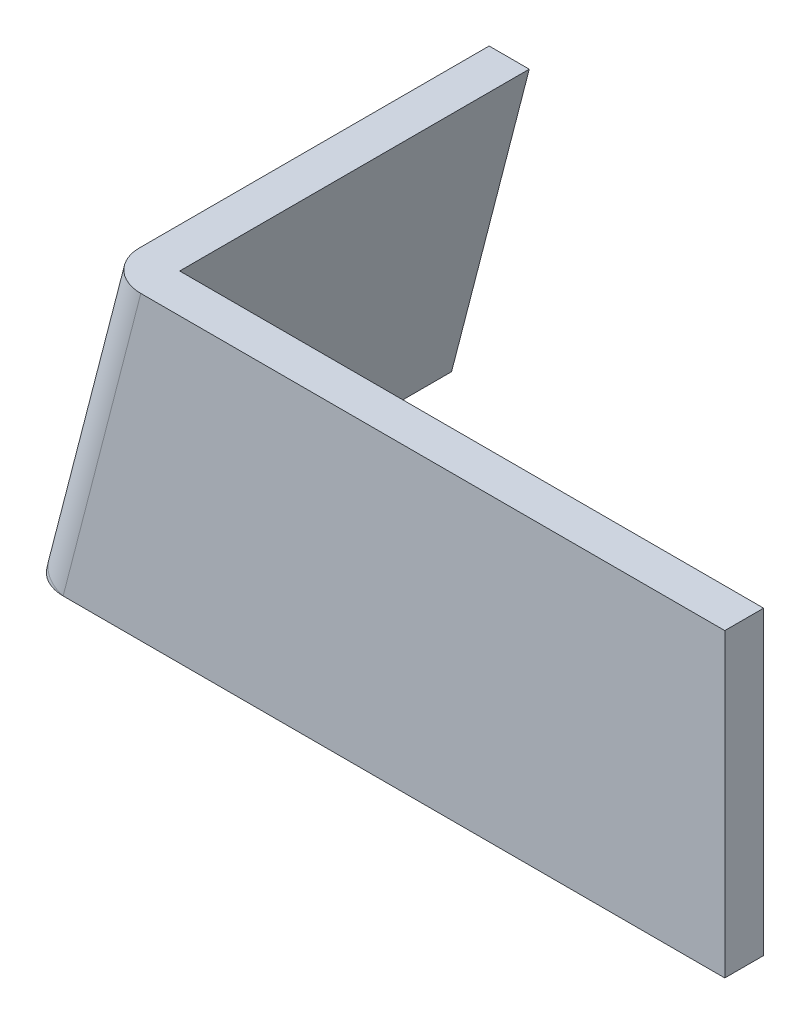
ISO-10303-21;
HEADER;
FILE_DESCRIPTION(('STEP AP214'),'2;1');
FILE_NAME('part.step','',(''),(''),'','','');
FILE_SCHEMA(('AUTOMOTIVE_DESIGN { 1 0 10303 214 1 1 1 1 }'));
ENDSEC;
DATA;
#1=APPLICATION_CONTEXT('core data for automotive mechanical design processes');
#2=APPLICATION_PROTOCOL_DEFINITION('international standard','automotive_design',2000,#1);
#3=PRODUCT_CONTEXT('',#1,'mechanical');
#4=PRODUCT('Part','Part','',(#3));
#5=PRODUCT_RELATED_PRODUCT_CATEGORY('part','',(#4));
#6=PRODUCT_DEFINITION_FORMATION('','',#4);
#7=PRODUCT_DEFINITION_CONTEXT('part definition',#1,'design');
#8=PRODUCT_DEFINITION('design','',#6,#7);
#9=PRODUCT_DEFINITION_SHAPE('','',#8);
#10=(LENGTH_UNIT() NAMED_UNIT(*) SI_UNIT(.MILLI.,.METRE.));
#11=(NAMED_UNIT(*) PLANE_ANGLE_UNIT() SI_UNIT($,.RADIAN.));
#12=(NAMED_UNIT(*) SI_UNIT($,.STERADIAN.) SOLID_ANGLE_UNIT());
#13=UNCERTAINTY_MEASURE_WITH_UNIT(LENGTH_MEASURE(1.E-05),#10,'distance_accuracy_value','');
#14=(GEOMETRIC_REPRESENTATION_CONTEXT(3) GLOBAL_UNCERTAINTY_ASSIGNED_CONTEXT((#13)) GLOBAL_UNIT_ASSIGNED_CONTEXT((#10,
#11,#12)) REPRESENTATION_CONTEXT('',''));
#15=CARTESIAN_POINT('',(0.,0.,0.));
#16=DIRECTION('',(0.,0.,1.));
#17=DIRECTION('',(1.,0.,0.));
#18=AXIS2_PLACEMENT_3D('',#15,#16,#17);
#19=CARTESIAN_POINT('',(-54.0821026600798,-24.5934553307693,-3.175));
#20=DIRECTION('',(0.,-1.,0.));
#21=DIRECTION('',(1.,0.,0.));
#22=AXIS2_PLACEMENT_3D('',#19,#20,#21);
#23=PLANE('',#22);
#24=DIRECTION('',(1.,0.,0.));
#25=VECTOR('',#24,1.);
#26=CARTESIAN_POINT('',(-54.0821026600798,-24.5934553307693,0.));
#27=LINE('',#26,#25);
#28=CARTESIAN_POINT('',(-54.0821026600799,-24.5934553307693,0.));
#29=VERTEX_POINT('',#28);
#30=CARTESIAN_POINT('',(0.,-24.5934553307693,0.));
#31=VERTEX_POINT('',#30);
#32=EDGE_CURVE('E184',#29,#31,#27,.T.);
#33=ORIENTED_EDGE('',*,*,#32,.F.);
#34=CARTESIAN_POINT('',(-54.0821026600799,-24.5934553307693,-3.17539815531388));
#35=DIRECTION('',(0.,-1.,0.));
#36=DIRECTION('',(-0.997768982834671,0.,-0.0667611930170928));
#37=AXIS2_PLACEMENT_3D('',#34,#35,#36);
#38=ELLIPSE('',#37,3.27583332198039,3.17496906059216);
#39=CARTESIAN_POINT('',(-57.3574933108672,-24.5934553307693,-3.18846297127676));
#40=VERTEX_POINT('',#39);
#41=EDGE_CURVE('E123',#29,#40,#38,.T.);
#42=ORIENTED_EDGE('',*,*,#41,.T.);
#43=DIRECTION('',(-0.996266633174579,0.,-0.0863295755983393));
#44=VECTOR('',#43,1.);
#45=CARTESIAN_POINT('',(-54.1053555637042,-24.5934553307693,-2.90665520802236));
#46=LINE('',#45,#44);
#47=CARTESIAN_POINT('',(-57.3612270822224,-24.5934553307693,-3.1887865140772));
#48=VERTEX_POINT('',#47);
#49=EDGE_CURVE('E131',#40,#48,#46,.T.);
#50=ORIENTED_EDGE('',*,*,#49,.T.);
#51=DIRECTION('',(0.,0.,1.));
#52=VECTOR('',#51,1.);
#53=CARTESIAN_POINT('',(-57.3612270822225,-24.5934553307693,-31.75));
#54=LINE('',#53,#52);
#55=CARTESIAN_POINT('',(-57.3612270822225,-24.5934553307693,-31.75));
#56=VERTEX_POINT('',#55);
#57=EDGE_CURVE('E140',#56,#48,#54,.T.);
#58=ORIENTED_EDGE('',*,*,#57,.F.);
#59=DIRECTION('',(1.,0.,0.));
#60=VECTOR('',#59,1.);
#61=CARTESIAN_POINT('',(-57.3612270822225,-24.5934553307693,-31.75));
#62=LINE('',#61,#60);
#63=CARTESIAN_POINT('',(-54.0821026600799,-24.5934553307693,-31.75));
#64=VERTEX_POINT('',#63);
#65=EDGE_CURVE('E122',#56,#64,#62,.T.);
#66=ORIENTED_EDGE('',*,*,#65,.T.);
#67=DIRECTION('',(0.,0.,-1.));
#68=VECTOR('',#67,1.);
#69=CARTESIAN_POINT('',(-54.0821026600799,-24.5934553307693,-31.75));
#70=LINE('',#69,#68);
#71=CARTESIAN_POINT('',(-54.0821026600799,-24.5934553307693,-3.175));
#72=VERTEX_POINT('',#71);
#73=EDGE_CURVE('E209',#72,#64,#70,.T.);
#74=ORIENTED_EDGE('',*,*,#73,.F.);
#75=DIRECTION('',(1.,0.,0.));
#76=VECTOR('',#75,1.);
#77=CARTESIAN_POINT('',(-54.0821026600798,-24.5934553307693,-3.175));
#78=LINE('',#77,#76);
#79=CARTESIAN_POINT('',(0.,-24.5934553307693,-3.175));
#80=VERTEX_POINT('',#79);
#81=EDGE_CURVE('E203',#72,#80,#78,.T.);
#82=ORIENTED_EDGE('',*,*,#81,.T.);
#83=DIRECTION('',(0.,0.,1.));
#84=VECTOR('',#83,1.);
#85=CARTESIAN_POINT('',(0.,-24.5934553307693,-3.175));
#86=LINE('',#85,#84);
#87=EDGE_CURVE('E68',#80,#31,#86,.T.);
#88=ORIENTED_EDGE('',*,*,#87,.T.);
#89=EDGE_LOOP('',(#33,#42,#50,#58,#66,#74,#82,#88));
#90=FACE_BOUND('',#89,.T.);
#91=ADVANCED_FACE('F41',(#90),#23,.T.);
#92=CARTESIAN_POINT('',(-54.0821026600798,-24.5934553307693,-3.175));
#93=DIRECTION('',(-0.249998310160622,-0.968246272864933,0.));
#94=DIRECTION('',(0.968246272864933,-0.249998310160622,0.));
#95=AXIS2_PLACEMENT_3D('',#92,#93,#94);
#96=CYLINDRICAL_SURFACE('',#95,3.175);
#97=CARTESIAN_POINT('',(-56.7478822577712,-23.9051589949321,-1.59370550162037));
#98=CARTESIAN_POINT('',(-56.7711528063119,-23.8990005716292,-1.63561448519397));
#99=CARTESIAN_POINT('',(-56.7934948955376,-23.8930798067713,-1.67807365239657));
#100=CARTESIAN_POINT('',(-56.8354626932077,-23.8819459792046,-1.76236131279245));
#101=CARTESIAN_POINT('',(-56.8551595568118,-23.8767145241438,-1.80415196062147));
#102=CARTESIAN_POINT('',(-56.8920119601038,-23.8669181343138,-1.88691114422475));
#103=CARTESIAN_POINT('',(-56.9092373550892,-23.8623349816802,-1.92784642962703));
#104=CARTESIAN_POINT('',(-56.9413262032603,-23.8537927363517,-2.00872437947304));
#105=CARTESIAN_POINT('',(-56.9562578716744,-23.8498156748152,-2.04863809339595));
#106=CARTESIAN_POINT('',(-56.9839396339711,-23.8424425251829,-2.12732283105584));
#107=CARTESIAN_POINT('',(-56.9967560481755,-23.8390287765273,-2.16606887915224));
#108=CARTESIAN_POINT('',(-57.0203872179549,-23.8327389821606,-2.24228719460897));
#109=CARTESIAN_POINT('',(-57.0312661629117,-23.8298456341856,-2.27973814348783));
#110=CARTESIAN_POINT('',(-57.0512002138387,-23.82455361604,-2.35325291310623));
#111=CARTESIAN_POINT('',(-57.0603171753002,-23.8221380410919,-2.3892987531281));
#112=CARTESIAN_POINT('',(-57.0769016220246,-23.8177591609919,-2.45990611810896));
#113=CARTESIAN_POINT('',(-57.0844284531324,-23.8157793770865,-2.49445269584014));
#114=CARTESIAN_POINT('',(-57.0980024198764,-23.8122306111437,-2.5619798028539));
#115=CARTESIAN_POINT('',(-57.1041062379697,-23.810645594031,-2.59494808754846));
#116=CARTESIAN_POINT('',(-57.1149981679932,-23.8078461318354,-2.6592485841057));
#117=CARTESIAN_POINT('',(-57.1198401779484,-23.806616100505,-2.69057105636289));
#118=CARTESIAN_POINT('',(-57.1322456645813,-23.8035195376749,-2.77926122970374));
#119=CARTESIAN_POINT('',(-57.1387575047564,-23.8019654150936,-2.83679128597679));
#120=CARTESIAN_POINT('',(-57.1481295882996,-23.7999483647781,-2.94477251925018));
#121=CARTESIAN_POINT('',(-57.1513495578362,-23.7993715719247,-2.99519100873396));
#122=CARTESIAN_POINT('',(-57.1552102364163,-23.7990644474782,-3.08874843676804));
#123=CARTESIAN_POINT('',(-57.1561590999732,-23.7992227367018,-3.1318744720145));
#124=CARTESIAN_POINT('',(-57.1562845764316,-23.7997106960311,-3.17500000000033));
#125=B_SPLINE_CURVE_WITH_KNOTS('',3,(#97,#98,#99,#100,#101,#102,#103,#104,#105,#106,#107,#108,
#109,#110,#111,#112,#113,#114,#115,#116,#117,#118,#119,#120,#121,#122,#123,#124),.UNSPECIFIED.,
.F.,.F.,(4,2,2,2,2,2,2,2,2,2,2,2,2,4),(0.,0.144977392350603,0.28441781372665,0.418321199294584,
0.546687493773405,0.669516652397637,0.786808642107576,0.898563443034387,1.00478105037227,
1.10546147676543,1.20060475538949,1.37426387395749,1.52578095973013,1.65515626804918),.UNSPECIFIED.);
#126=CARTESIAN_POINT('',(-56.747882249653,-23.9051589630672,-1.59370550144556));
#127=VERTEX_POINT('',#126);
#128=CARTESIAN_POINT('',(-57.1562845764261,-23.7997106960093,-3.17499999999999));
#129=VERTEX_POINT('',#128);
#130=EDGE_CURVE('E111',#127,#129,#125,.T.);
#131=ORIENTED_EDGE('',*,*,#130,.F.);
#132=CARTESIAN_POINT('',(-54.0821026600799,-24.5934553307693,0.));
#133=CARTESIAN_POINT('',(-54.1157099374046,-24.5847780354022,2.73944538508986E-06));
#134=CARTESIAN_POINT('',(-54.1493172960913,-24.5761009390674,-0.000564198564706343));
#135=CARTESIAN_POINT('',(-54.2164958173967,-24.558756389128,-0.00283585215355638));
#136=CARTESIAN_POINT('',(-54.2500669802295,-24.5500889354665,-0.0045405609599823));
#137=CARTESIAN_POINT('',(-54.3171369625782,-24.5327728609201,-0.00908616596803834));
#138=CARTESIAN_POINT('',(-54.3506357825015,-24.5241242399292,-0.0119270557528398));
#139=CARTESIAN_POINT('',(-54.4175250269981,-24.506855022913,-0.0187418828004924));
#140=CARTESIAN_POINT('',(-54.4509154521497,-24.4982344267383,-0.0227158140093497));
#141=CARTESIAN_POINT('',(-54.5175519743002,-24.4810304404912,-0.0317924537572283));
#142=CARTESIAN_POINT('',(-54.5507980720256,-24.4724470502318,-0.0368951566088904));
#143=CARTESIAN_POINT('',(-54.6171101683468,-24.4553266369128,-0.0482238323962279));
#144=CARTESIAN_POINT('',(-54.6501761677944,-24.4467896136341,-0.0544498000144505));
#145=CARTESIAN_POINT('',(-54.7160924958144,-24.4297710652459,-0.0680182968202627));
#146=CARTESIAN_POINT('',(-54.7489428253414,-24.4212895398909,-0.0753608210622865));
#147=CARTESIAN_POINT('',(-54.814392479542,-24.4043910784339,-0.0911545205775304));
#148=CARTESIAN_POINT('',(-54.8469918052504,-24.3959741420657,-0.0996056912779563));
#149=CARTESIAN_POINT('',(-54.9119043935106,-24.379213899995,-0.117607581825767));
#150=CARTESIAN_POINT('',(-54.9442176571546,-24.3708705940114,-0.127158297472873));
#151=CARTESIAN_POINT('',(-55.0085233764121,-24.3542665947061,-0.147348993958212));
#152=CARTESIAN_POINT('',(-55.0405158331529,-24.3460059010941,-0.157988970967303));
#153=CARTESIAN_POINT('',(-55.1041455443637,-24.3295760395574,-0.180346735290134));
#154=CARTESIAN_POINT('',(-55.1357827999739,-24.3214068713391,-0.192064519143372));
#155=CARTESIAN_POINT('',(-55.1986681028465,-24.3051688946688,-0.216565284038739));
#156=CARTESIAN_POINT('',(-55.2299161512398,-24.2971000859253,-0.2293482619854));
#157=CARTESIAN_POINT('',(-55.2919894562735,-24.2810715753067,-0.25596565586718));
#158=CARTESIAN_POINT('',(-55.3228147140135,-24.2731118731478,-0.26980006906717));
#159=CARTESIAN_POINT('',(-55.3840093207656,-24.2573102209414,-0.298505448453141));
#160=CARTESIAN_POINT('',(-55.4143786708246,-24.2494682706236,-0.313376412258539));
#161=CARTESIAN_POINT('',(-55.4746288187047,-24.2339106766308,-0.344138877721569));
#162=CARTESIAN_POINT('',(-55.504509617499,-24.2261950327044,-0.360030377346348));
#163=CARTESIAN_POINT('',(-55.5637506345039,-24.21089842983,-0.392816862450521));
#164=CARTESIAN_POINT('',(-55.5931108535927,-24.2033174706547,-0.409711846236787));
#165=CARTESIAN_POINT('',(-55.6498941822506,-24.1886562523893,-0.443659087683807));
#166=CARTESIAN_POINT('',(-55.6773429634758,-24.1815693395834,-0.460665555374456));
#167=CARTESIAN_POINT('',(-55.7318944310192,-24.1674852773682,-0.495672028670232));
#168=CARTESIAN_POINT('',(-55.7589935857102,-24.1604890424892,-0.513677906735295));
#169=CARTESIAN_POINT('',(-55.8128081973952,-24.1465958452047,-0.550682931994819));
#170=CARTESIAN_POINT('',(-55.8395199201364,-24.1396998482868,-0.569687872209887));
#171=CARTESIAN_POINT('',(-55.8925216009666,-24.126016814808,-0.608689326421263));
#172=CARTESIAN_POINT('',(-55.918807623112,-24.1192307948655,-0.628691546163608));
#173=CARTESIAN_POINT('',(-55.9709192882396,-24.1057775581699,-0.669684320278728));
#174=CARTESIAN_POINT('',(-55.9967407939526,-24.099111409179,-0.690680484725102));
#175=CARTESIAN_POINT('',(-56.0478843504967,-24.0859079035336,-0.733656333598126));
#176=CARTESIAN_POINT('',(-56.0732020636502,-24.0793716657416,-0.755641524039728));
#177=CARTESIAN_POINT('',(-56.1232985425061,-24.0664381041757,-0.800588981402428));
#178=CARTESIAN_POINT('',(-56.148072771303,-24.0600419502331,-0.82355664176506));
#179=CARTESIAN_POINT('',(-56.1970424317321,-24.047398797156,-0.870460920831477));
#180=CARTESIAN_POINT('',(-56.2212331287646,-24.0411530186074,-0.894402811812722));
#181=CARTESIAN_POINT('',(-56.2689955783034,-24.028820961661,-0.943245713471639));
#182=CARTESIAN_POINT('',(-56.2925624003899,-24.0227359543019,-0.968151866598056));
#183=CARTESIAN_POINT('',(-56.3390367187417,-24.0107358742916,-1.01891168961102));
#184=CARTESIAN_POINT('',(-56.361939090998,-24.0048221227404,-1.04477036339452));
#185=CARTESIAN_POINT('',(-56.407043960391,-23.9931750620872,-1.09742181895107));
#186=CARTESIAN_POINT('',(-56.4292411425197,-23.987443123664,-1.12421945730376));
#187=CARTESIAN_POINT('',(-56.4728949860338,-23.9761702527388,-1.17873358638157));
#188=CARTESIAN_POINT('',(-56.4943461443866,-23.9706307399146,-1.20645477756571));
#189=CARTESIAN_POINT('',(-56.5364672635188,-23.9597533233775,-1.26279887727533));
#190=CARTESIAN_POINT('',(-56.5571315365473,-23.9544168876761,-1.29142632135177));
#191=CARTESIAN_POINT('',(-56.5976382814938,-23.9439562429209,-1.34956385925633));
#192=CARTESIAN_POINT('',(-56.6174748848128,-23.9388335494068,-1.3790783148282));
#193=CARTESIAN_POINT('',(-56.656285730845,-23.9288110268907,-1.43896891217223));
#194=CARTESIAN_POINT('',(-56.6752539277073,-23.9239127602077,-1.46934923342472));
#195=CARTESIAN_POINT('',(-56.7122879342514,-23.9143496335694,-1.53094841438096));
#196=CARTESIAN_POINT('',(-56.7303475273244,-23.9096863812733,-1.56217126129165));
#197=CARTESIAN_POINT('',(-56.7478822498346,-23.9051589630204,-1.59370550133781));
#198=B_SPLINE_CURVE_WITH_KNOTS('',3,(#132,#133,#134,#135,#136,#137,#138,#139,#140,#141,#142,
#143,#144,#145,#146,#147,#148,#149,#150,#151,#152,#153,#154,#155,#156,#157,#158,#159,#160,#161,
#162,#163,#164,#165,#166,#167,#168,#169,#170,#171,#172,#173,#174,#175,#176,#177,#178,#179,#180,
#181,#182,#183,#184,#185,#186,#187,#188,#189,#190,#191,#192,#193,#194,#195,#196,#197),
.UNSPECIFIED.,.F.,.F.,(4,2,2,2,2,2,2,2,2,2,2,2,2,2,2,2,2,2,2,2,2,2,2,2,2,2,2,2,2,2,2,2,4),(0.,
0.104123602299379,0.208246584831235,0.312368979314257,0.416490817467647,0.520612131011114,
0.624732951664863,0.728853311149535,0.832973241186201,0.937092773496319,1.04121193980172,
1.14533077182455,1.24944930128728,1.35356755991265,1.45768557942365,1.56180339154349,
1.66592102799556,1.76508126434541,1.86490317900106,1.96538679770208,2.06653214565449,
2.16833924754433,2.27080812755097,2.37393880935984,2.47773131617491,2.58218567073061,
2.68730189530352,2.79308001172362,2.89952004138518,3.00662200525739,3.11438592389458,
3.22281181744616,3.3318997056663),.UNSPECIFIED.);
#199=EDGE_CURVE('E11',#29,#127,#198,.T.);
#200=ORIENTED_EDGE('',*,*,#199,.F.);
#201=DIRECTION('',(-0.249998310160622,-0.968246272864933,0.));
#202=VECTOR('',#201,1.);
#203=CARTESIAN_POINT('',(-47.732145582,0.,0.));
#204=LINE('',#203,#202);
#205=CARTESIAN_POINT('',(-47.732145582,0.,0.));
#206=VERTEX_POINT('',#205);
#207=EDGE_CURVE('E149',#206,#29,#204,.T.);
#208=ORIENTED_EDGE('',*,*,#207,.F.);
#209=CARTESIAN_POINT('',(-47.732145582,0.,-3.175));
#210=DIRECTION('',(0.,-1.,0.));
#211=DIRECTION('',(-1.,0.,0.));
#212=AXIS2_PLACEMENT_3D('',#209,#210,#211);
#213=ELLIPSE('',#212,3.27912442214266,3.175);
#214=CARTESIAN_POINT('',(-51.0112700041428,0.,-3.17499999999999));
#215=VERTEX_POINT('',#214);
#216=EDGE_CURVE('E145',#206,#215,#213,.T.);
#217=ORIENTED_EDGE('',*,*,#216,.T.);
#218=DIRECTION('',(-0.249998310160622,-0.968246272864933,0.));
#219=VECTOR('',#218,1.);
#220=CARTESIAN_POINT('',(-57.156284576426,-23.7997106960093,-3.17499999999999));
#221=LINE('',#220,#219);
#222=EDGE_CURVE('E138',#215,#129,#221,.T.);
#223=ORIENTED_EDGE('',*,*,#222,.T.);
#224=EDGE_LOOP('',(#131,#200,#208,#217,#223));
#225=FACE_BOUND('',#224,.T.);
#226=ADVANCED_FACE('F143',(#225),#96,.T.);
#227=CARTESIAN_POINT('',(-47.8231087291644,12.34778455025,1.72333838631021E-13));
#228=DIRECTION('',(-0.968246272864933,0.249998310160622,0.));
#229=DIRECTION('',(-0.249998310160622,-0.968246272864933,0.));
#230=AXIS2_PLACEMENT_3D('',#227,#228,#229);
#231=PLANE('',#230);
#232=ORIENTED_EDGE('',*,*,#57,.T.);
#233=DIRECTION('',(0.249962964673882,0.968109379396425,0.0168150473122455));
#234=VECTOR('',#233,1.);
#235=CARTESIAN_POINT('',(-47.8124026790159,12.3892492031383,-2.54643561891269));
#236=LINE('',#235,#234);
#237=EDGE_CURVE('E129',#48,#129,#236,.T.);
#238=ORIENTED_EDGE('',*,*,#237,.T.);
#239=ORIENTED_EDGE('',*,*,#222,.F.);
#240=DIRECTION('',(0.,0.,1.));
#241=VECTOR('',#240,1.);
#242=CARTESIAN_POINT('',(-51.0112700041428,0.,-36.068));
#243=LINE('',#242,#241);
#244=CARTESIAN_POINT('',(-51.0112700041428,0.,-31.75));
#245=VERTEX_POINT('',#244);
#246=EDGE_CURVE('E215',#245,#215,#243,.T.);
#247=ORIENTED_EDGE('',*,*,#246,.F.);
#248=DIRECTION('',(0.249998310160622,0.968246272864933,0.));
#249=VECTOR('',#248,1.);
#250=CARTESIAN_POINT('',(-50.8063274983463,0.793744634759995,-31.75));
#251=LINE('',#250,#249);
#252=EDGE_CURVE('E146',#56,#245,#251,.T.);
#253=ORIENTED_EDGE('',*,*,#252,.F.);
#254=EDGE_LOOP('',(#232,#238,#239,#247,#253));
#255=FACE_BOUND('',#254,.T.);
#256=ADVANCED_FACE('F136',(#255),#231,.T.);
#257=CARTESIAN_POINT('',(-47.732145582,0.,-3.175));
#258=DIRECTION('',(0.,1.,0.));
#259=DIRECTION('',(0.,0.,1.));
#260=AXIS2_PLACEMENT_3D('',#257,#258,#259);
#261=PLANE('',#260);
#262=DIRECTION('',(-1.,0.,0.));
#263=VECTOR('',#262,1.);
#264=CARTESIAN_POINT('',(-47.732145582,0.,0.));
#265=LINE('',#264,#263);
#266=CARTESIAN_POINT('',(0.,0.,0.));
#267=VERTEX_POINT('',#266);
#268=EDGE_CURVE('E194',#267,#206,#265,.T.);
#269=ORIENTED_EDGE('',*,*,#268,.F.);
#270=DIRECTION('',(0.,0.,1.));
#271=VECTOR('',#270,1.);
#272=CARTESIAN_POINT('',(0.,0.,-3.175));
#273=LINE('',#272,#271);
#274=CARTESIAN_POINT('',(0.,0.,-3.175));
#275=VERTEX_POINT('',#274);
#276=EDGE_CURVE('E50',#275,#267,#273,.T.);
#277=ORIENTED_EDGE('',*,*,#276,.F.);
#278=DIRECTION('',(-1.,0.,0.));
#279=VECTOR('',#278,1.);
#280=CARTESIAN_POINT('',(-47.732145582,0.,-3.175));
#281=LINE('',#280,#279);
#282=CARTESIAN_POINT('',(-47.732145582,0.,-3.175));
#283=VERTEX_POINT('',#282);
#284=EDGE_CURVE('E73',#275,#283,#281,.T.);
#285=ORIENTED_EDGE('',*,*,#284,.T.);
#286=DIRECTION('',(0.,0.,1.));
#287=VECTOR('',#286,1.);
#288=CARTESIAN_POINT('',(-47.732145582,0.,-3.175));
#289=LINE('',#288,#287);
#290=CARTESIAN_POINT('',(-47.732145582,0.,-31.75));
#291=VERTEX_POINT('',#290);
#292=EDGE_CURVE('E147',#291,#283,#289,.T.);
#293=ORIENTED_EDGE('',*,*,#292,.F.);
#294=DIRECTION('',(-1.,0.,0.));
#295=VECTOR('',#294,1.);
#296=CARTESIAN_POINT('',(-50.8063274983463,0.,-31.75));
#297=LINE('',#296,#295);
#298=EDGE_CURVE('E213',#291,#245,#297,.T.);
#299=ORIENTED_EDGE('',*,*,#298,.T.);
#300=ORIENTED_EDGE('',*,*,#246,.T.);
#301=ORIENTED_EDGE('',*,*,#216,.F.);
#302=EDGE_LOOP('',(#269,#277,#285,#293,#299,#300,#301));
#303=FACE_BOUND('',#302,.T.);
#304=ADVANCED_FACE('F248',(#303),#261,.T.);
#305=CARTESIAN_POINT('',(0.,-24.5934553307693,-3.175));
#306=DIRECTION('',(1.,0.,0.));
#307=DIRECTION('',(0.,0.,-1.));
#308=AXIS2_PLACEMENT_3D('',#305,#306,#307);
#309=PLANE('',#308);
#310=DIRECTION('',(0.,1.,0.));
#311=VECTOR('',#310,1.);
#312=CARTESIAN_POINT('',(0.,-24.5934553307693,0.));
#313=LINE('',#312,#311);
#314=EDGE_CURVE('E187',#31,#267,#313,.T.);
#315=ORIENTED_EDGE('',*,*,#314,.F.);
#316=ORIENTED_EDGE('',*,*,#87,.F.);
#317=DIRECTION('',(0.,1.,0.));
#318=VECTOR('',#317,1.);
#319=CARTESIAN_POINT('',(0.,-24.5934553307693,-3.175));
#320=LINE('',#319,#318);
#321=EDGE_CURVE('E201',#80,#275,#320,.T.);
#322=ORIENTED_EDGE('',*,*,#321,.T.);
#323=ORIENTED_EDGE('',*,*,#276,.T.);
#324=EDGE_LOOP('',(#315,#316,#322,#323));
#325=FACE_BOUND('',#324,.T.);
#326=ADVANCED_FACE('F267',(#325),#309,.T.);
#327=CARTESIAN_POINT('',(0.,0.,-3.175));
#328=DIRECTION('',(0.,0.,1.));
#329=DIRECTION('',(1.,0.,0.));
#330=AXIS2_PLACEMENT_3D('',#327,#328,#329);
#331=PLANE('',#330);
#332=DIRECTION('',(-0.249998310160622,-0.968246272864933,0.));
#333=VECTOR('',#332,1.);
#334=CARTESIAN_POINT('',(-47.732145582,0.,-3.175));
#335=LINE('',#334,#333);
#336=EDGE_CURVE('E197',#283,#72,#335,.T.);
#337=ORIENTED_EDGE('',*,*,#336,.F.);
#338=ORIENTED_EDGE('',*,*,#284,.F.);
#339=ORIENTED_EDGE('',*,*,#321,.F.);
#340=ORIENTED_EDGE('',*,*,#81,.F.);
#341=EDGE_LOOP('',(#337,#338,#339,#340));
#342=FACE_BOUND('',#341,.T.);
#343=ADVANCED_FACE('F170',(#342),#331,.F.);
#344=CARTESIAN_POINT('',(0.,0.,0.));
#345=DIRECTION('',(0.,0.,1.));
#346=DIRECTION('',(1.,0.,0.));
#347=AXIS2_PLACEMENT_3D('',#344,#345,#346);
#348=PLANE('',#347);
#349=ORIENTED_EDGE('',*,*,#207,.T.);
#350=ORIENTED_EDGE('',*,*,#32,.T.);
#351=ORIENTED_EDGE('',*,*,#314,.T.);
#352=ORIENTED_EDGE('',*,*,#268,.T.);
#353=EDGE_LOOP('',(#349,#350,#351,#352));
#354=FACE_BOUND('',#353,.T.);
#355=ADVANCED_FACE('F254',(#354),#348,.T.);
#356=CARTESIAN_POINT('',(-50.8063274983463,0.793744634759995,-31.75));
#357=DIRECTION('',(0.,0.,-1.));
#358=DIRECTION('',(-1.,0.,0.));
#359=AXIS2_PLACEMENT_3D('',#356,#357,#358);
#360=PLANE('',#359);
#361=ORIENTED_EDGE('',*,*,#298,.F.);
#362=DIRECTION('',(0.249998310160622,0.968246272864933,0.));
#363=VECTOR('',#362,1.);
#364=CARTESIAN_POINT('',(-47.7321455820001,0.,-31.75));
#365=LINE('',#364,#363);
#366=EDGE_CURVE('E152',#64,#291,#365,.T.);
#367=ORIENTED_EDGE('',*,*,#366,.F.);
#368=ORIENTED_EDGE('',*,*,#65,.F.);
#369=ORIENTED_EDGE('',*,*,#252,.T.);
#370=EDGE_LOOP('',(#361,#367,#368,#369));
#371=FACE_BOUND('',#370,.T.);
#372=ADVANCED_FACE('F168',(#371),#360,.T.);
#373=CARTESIAN_POINT('',(-44.7489268128183,11.5540399154901,1.61248385380194E-13));
#374=DIRECTION('',(-0.968246272864933,0.249998310160622,0.));
#375=DIRECTION('',(-0.249998310160622,-0.968246272864933,0.));
#376=AXIS2_PLACEMENT_3D('',#373,#374,#375);
#377=PLANE('',#376);
#378=ORIENTED_EDGE('',*,*,#336,.T.);
#379=ORIENTED_EDGE('',*,*,#73,.T.);
#380=ORIENTED_EDGE('',*,*,#366,.T.);
#381=ORIENTED_EDGE('',*,*,#292,.T.);
#382=EDGE_LOOP('',(#378,#379,#380,#381));
#383=FACE_BOUND('',#382,.T.);
#384=ADVANCED_FACE('F238',(#383),#377,.F.);
#385=CARTESIAN_POINT('',(-53.3748154391234,-21.8032909851311,-3.12807323392511));
#386=DIRECTION('',(-0.245687877232216,-0.969209586851858,-0.0164390916896017));
#387=DIRECTION('',(0.969340574811117,-0.245721081767221,0.));
#388=AXIS2_PLACEMENT_3D('',#385,#386,#387);
#389=CYLINDRICAL_SURFACE('',#388,3.17496906059216);
#390=ORIENTED_EDGE('',*,*,#130,.T.);
#391=DIRECTION('',(-0.245687877232216,-0.969209586851858,-0.0164390916896017));
#392=VECTOR('',#391,1.);
#393=CARTESIAN_POINT('',(-56.4524424463065,-21.0231368258328,-3.12790559126324));
#394=LINE('',#393,#392);
#395=EDGE_CURVE('E115',#129,#40,#394,.T.);
#396=ORIENTED_EDGE('',*,*,#395,.T.);
#397=ORIENTED_EDGE('',*,*,#41,.F.);
#398=ORIENTED_EDGE('',*,*,#199,.T.);
#399=EDGE_LOOP('',(#390,#396,#397,#398));
#400=FACE_BOUND('',#399,.T.);
#401=ADVANCED_FACE('F114',(#400),#389,.T.);
#402=CARTESIAN_POINT('',(-56.4524424463065,-21.0231368258328,-3.12790559126324));
#403=DIRECTION('',(-0.0863285025631754,0.00498586852840238,0.996254250058798));
#404=DIRECTION('',(0.996266633174579,0.,0.0863295755983393));
#405=AXIS2_PLACEMENT_3D('',#402,#403,#404);
#406=PLANE('',#405);
#407=ORIENTED_EDGE('',*,*,#395,.F.);
#408=ORIENTED_EDGE('',*,*,#237,.F.);
#409=ORIENTED_EDGE('',*,*,#49,.F.);
#410=EDGE_LOOP('',(#407,#408,#409));
#411=FACE_BOUND('',#410,.T.);
#412=ADVANCED_FACE('F128',(#411),#406,.T.);
#413=CLOSED_SHELL('',(#91,#226,#256,#304,#326,#343,#355,#372,#384,#401,#412));
#414=MANIFOLD_SOLID_BREP('B2',#413);
#415=ADVANCED_BREP_SHAPE_REPRESENTATION('',(#18,#414),#14);
#416=SHAPE_DEFINITION_REPRESENTATION(#9,#415);
ENDSEC;
END-ISO-10303-21;
